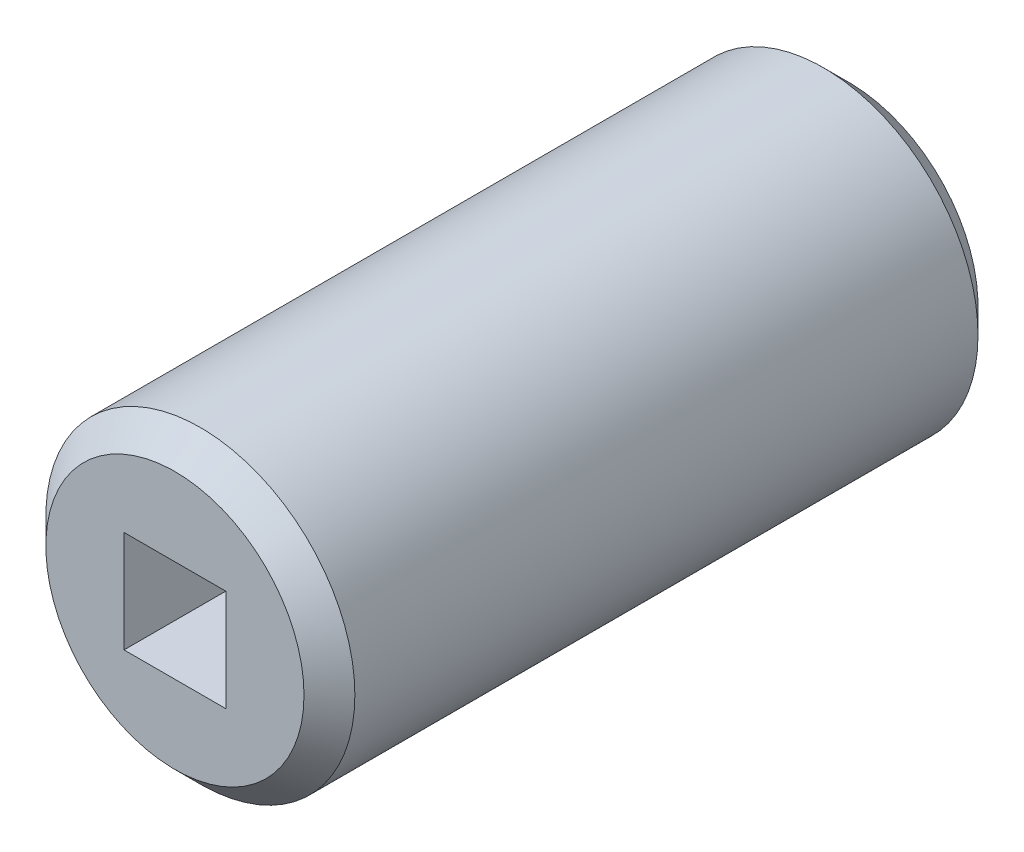
ISO-10303-21;
HEADER;
FILE_DESCRIPTION(('STEP AP214'),'2;1');
FILE_NAME('part.step','',(''),(''),'','','');
FILE_SCHEMA(('AUTOMOTIVE_DESIGN { 1 0 10303 214 1 1 1 1 }'));
ENDSEC;
DATA;
#1=APPLICATION_CONTEXT('core data for automotive mechanical design processes');
#2=APPLICATION_PROTOCOL_DEFINITION('international standard','automotive_design',2000,#1);
#3=PRODUCT_CONTEXT('',#1,'mechanical');
#4=PRODUCT('Part','Part','',(#3));
#5=PRODUCT_RELATED_PRODUCT_CATEGORY('part','',(#4));
#6=PRODUCT_DEFINITION_FORMATION('','',#4);
#7=PRODUCT_DEFINITION_CONTEXT('part definition',#1,'design');
#8=PRODUCT_DEFINITION('design','',#6,#7);
#9=PRODUCT_DEFINITION_SHAPE('','',#8);
#10=(LENGTH_UNIT() NAMED_UNIT(*) SI_UNIT(.MILLI.,.METRE.));
#11=(NAMED_UNIT(*) PLANE_ANGLE_UNIT() SI_UNIT($,.RADIAN.));
#12=(NAMED_UNIT(*) SI_UNIT($,.STERADIAN.) SOLID_ANGLE_UNIT());
#13=UNCERTAINTY_MEASURE_WITH_UNIT(LENGTH_MEASURE(1.E-05),#10,'distance_accuracy_value','');
#14=(GEOMETRIC_REPRESENTATION_CONTEXT(3) GLOBAL_UNCERTAINTY_ASSIGNED_CONTEXT((#13)) GLOBAL_UNIT_ASSIGNED_CONTEXT((#10,
#11,#12)) REPRESENTATION_CONTEXT('',''));
#15=CARTESIAN_POINT('',(0.,0.,0.));
#16=DIRECTION('',(0.,0.,1.));
#17=DIRECTION('',(1.,0.,0.));
#18=AXIS2_PLACEMENT_3D('',#15,#16,#17);
#19=CARTESIAN_POINT('',(0.,0.,-17.3));
#20=DIRECTION('',(0.,0.,1.));
#21=DIRECTION('',(1.,0.,0.));
#22=AXIS2_PLACEMENT_3D('',#19,#20,#21);
#23=CYLINDRICAL_SURFACE('',#22,6.075);
#24=CARTESIAN_POINT('',(0.,0.,8.20000000000002));
#25=DIRECTION('',(0.,0.,1.));
#26=DIRECTION('',(1.,0.,0.));
#27=AXIS2_PLACEMENT_3D('',#24,#25,#26);
#28=CIRCLE('',#27,6.075);
#29=CARTESIAN_POINT('',(6.075,0.,8.20000000000002));
#30=VERTEX_POINT('',#29);
#31=EDGE_CURVE('E12',#30,#30,#28,.F.);
#32=ORIENTED_EDGE('',*,*,#31,.T.);
#33=EDGE_LOOP('',(#32));
#34=FACE_BOUND('',#33,.T.);
#35=CARTESIAN_POINT('',(0.,0.,-16.3));
#36=DIRECTION('',(0.,0.,-1.));
#37=DIRECTION('',(-1.,0.,0.));
#38=AXIS2_PLACEMENT_3D('',#35,#36,#37);
#39=CIRCLE('',#38,6.075);
#40=CARTESIAN_POINT('',(-6.075,0.,-16.3));
#41=VERTEX_POINT('',#40);
#42=EDGE_CURVE('E117',#41,#41,#39,.F.);
#43=ORIENTED_EDGE('',*,*,#42,.T.);
#44=EDGE_LOOP('',(#43));
#45=FACE_BOUND('',#44,.T.);
#46=ADVANCED_FACE('F37',(#34,#45),#23,.T.);
#47=CARTESIAN_POINT('',(0.,0.,-17.3));
#48=DIRECTION('',(0.,0.,-1.));
#49=DIRECTION('',(-1.,0.,0.));
#50=AXIS2_PLACEMENT_3D('',#47,#48,#49);
#51=PLANE('',#50);
#52=DIRECTION('',(0.,1.,0.));
#53=VECTOR('',#52,1.);
#54=CARTESIAN_POINT('',(2.,-2.,-17.3));
#55=LINE('',#54,#53);
#56=CARTESIAN_POINT('',(2.,-2.,-17.3));
#57=VERTEX_POINT('',#56);
#58=CARTESIAN_POINT('',(2.,2.,-17.3));
#59=VERTEX_POINT('',#58);
#60=EDGE_CURVE('E80',#57,#59,#55,.T.);
#61=ORIENTED_EDGE('',*,*,#60,.T.);
#62=DIRECTION('',(-1.,0.,0.));
#63=VECTOR('',#62,1.);
#64=CARTESIAN_POINT('',(2.,2.,-17.3));
#65=LINE('',#64,#63);
#66=CARTESIAN_POINT('',(-2.,2.,-17.3));
#67=VERTEX_POINT('',#66);
#68=EDGE_CURVE('E89',#59,#67,#65,.T.);
#69=ORIENTED_EDGE('',*,*,#68,.T.);
#70=DIRECTION('',(0.,-1.,0.));
#71=VECTOR('',#70,1.);
#72=CARTESIAN_POINT('',(-2.,2.,-17.3));
#73=LINE('',#72,#71);
#74=CARTESIAN_POINT('',(-2.,-2.,-17.3));
#75=VERTEX_POINT('',#74);
#76=EDGE_CURVE('E52',#67,#75,#73,.T.);
#77=ORIENTED_EDGE('',*,*,#76,.T.);
#78=DIRECTION('',(1.,0.,0.));
#79=VECTOR('',#78,1.);
#80=CARTESIAN_POINT('',(-2.,-2.,-17.3));
#81=LINE('',#80,#79);
#82=EDGE_CURVE('E86',#75,#57,#81,.T.);
#83=ORIENTED_EDGE('',*,*,#82,.T.);
#84=EDGE_LOOP('',(#61,#69,#77,#83));
#85=FACE_BOUND('',#84,.T.);
#86=CARTESIAN_POINT('',(0.,0.,-17.3));
#87=DIRECTION('',(0.,0.,-1.));
#88=DIRECTION('',(-1.,0.,0.));
#89=AXIS2_PLACEMENT_3D('',#86,#87,#88);
#90=CIRCLE('',#89,5.075);
#91=CARTESIAN_POINT('',(-5.075,0.,-17.3));
#92=VERTEX_POINT('',#91);
#93=EDGE_CURVE('E111',#92,#92,#90,.T.);
#94=ORIENTED_EDGE('',*,*,#93,.T.);
#95=EDGE_LOOP('',(#94));
#96=FACE_BOUND('',#95,.T.);
#97=ADVANCED_FACE('F93',(#85,#96),#51,.T.);
#98=CARTESIAN_POINT('',(0.,0.,-17.3));
#99=DIRECTION('',(0.,0.,1.));
#100=DIRECTION('',(1.,0.,0.));
#101=AXIS2_PLACEMENT_3D('',#98,#99,#100);
#102=CONICAL_SURFACE('',#101,5.075,0.785398163397444);
#103=ORIENTED_EDGE('',*,*,#42,.F.);
#104=EDGE_LOOP('',(#103));
#105=FACE_BOUND('',#104,.T.);
#106=ORIENTED_EDGE('',*,*,#93,.F.);
#107=EDGE_LOOP('',(#106));
#108=FACE_BOUND('',#107,.T.);
#109=ADVANCED_FACE('F132',(#105,#108),#102,.T.);
#110=CARTESIAN_POINT('',(0.,0.,9.20000000000002));
#111=DIRECTION('',(0.,0.,1.));
#112=DIRECTION('',(1.,0.,0.));
#113=AXIS2_PLACEMENT_3D('',#110,#111,#112);
#114=PLANE('',#113);
#115=DIRECTION('',(0.,1.,0.));
#116=VECTOR('',#115,1.);
#117=CARTESIAN_POINT('',(2.,-2.,9.20000000000002));
#118=LINE('',#117,#116);
#119=CARTESIAN_POINT('',(2.,-2.,9.20000000000002));
#120=VERTEX_POINT('',#119);
#121=CARTESIAN_POINT('',(2.,2.,9.20000000000002));
#122=VERTEX_POINT('',#121);
#123=EDGE_CURVE('E60',#120,#122,#118,.T.);
#124=ORIENTED_EDGE('',*,*,#123,.F.);
#125=DIRECTION('',(1.,0.,0.));
#126=VECTOR('',#125,1.);
#127=CARTESIAN_POINT('',(-2.,-2.,9.20000000000002));
#128=LINE('',#127,#126);
#129=CARTESIAN_POINT('',(-2.,-2.,9.20000000000002));
#130=VERTEX_POINT('',#129);
#131=EDGE_CURVE('E96',#130,#120,#128,.T.);
#132=ORIENTED_EDGE('',*,*,#131,.F.);
#133=DIRECTION('',(0.,-1.,0.));
#134=VECTOR('',#133,1.);
#135=CARTESIAN_POINT('',(-2.,2.,9.20000000000002));
#136=LINE('',#135,#134);
#137=CARTESIAN_POINT('',(-2.,2.,9.20000000000002));
#138=VERTEX_POINT('',#137);
#139=EDGE_CURVE('E99',#138,#130,#136,.T.);
#140=ORIENTED_EDGE('',*,*,#139,.F.);
#141=DIRECTION('',(-1.,0.,0.));
#142=VECTOR('',#141,1.);
#143=CARTESIAN_POINT('',(2.,2.,9.20000000000002));
#144=LINE('',#143,#142);
#145=EDGE_CURVE('E105',#122,#138,#144,.T.);
#146=ORIENTED_EDGE('',*,*,#145,.F.);
#147=EDGE_LOOP('',(#124,#132,#140,#146));
#148=FACE_BOUND('',#147,.T.);
#149=CARTESIAN_POINT('',(0.,0.,9.20000000000002));
#150=DIRECTION('',(0.,0.,1.));
#151=DIRECTION('',(1.,0.,0.));
#152=AXIS2_PLACEMENT_3D('',#149,#150,#151);
#153=CIRCLE('',#152,5.075);
#154=CARTESIAN_POINT('',(5.075,0.,9.20000000000002));
#155=VERTEX_POINT('',#154);
#156=EDGE_CURVE('E45',#155,#155,#153,.T.);
#157=ORIENTED_EDGE('',*,*,#156,.T.);
#158=EDGE_LOOP('',(#157));
#159=FACE_BOUND('',#158,.T.);
#160=ADVANCED_FACE('F122',(#148,#159),#114,.T.);
#161=CARTESIAN_POINT('',(0.,0.,9.20000000000002));
#162=DIRECTION('',(0.,0.,-1.));
#163=DIRECTION('',(-1.,0.,0.));
#164=AXIS2_PLACEMENT_3D('',#161,#162,#163);
#165=CONICAL_SURFACE('',#164,5.075,0.785398163397446);
#166=ORIENTED_EDGE('',*,*,#31,.F.);
#167=EDGE_LOOP('',(#166));
#168=FACE_BOUND('',#167,.T.);
#169=ORIENTED_EDGE('',*,*,#156,.F.);
#170=EDGE_LOOP('',(#169));
#171=FACE_BOUND('',#170,.T.);
#172=ADVANCED_FACE('F39',(#168,#171),#165,.T.);
#173=CARTESIAN_POINT('',(2.,-2.,-17.3));
#174=DIRECTION('',(1.,0.,0.));
#175=DIRECTION('',(0.,1.,0.));
#176=AXIS2_PLACEMENT_3D('',#173,#174,#175);
#177=PLANE('',#176);
#178=ORIENTED_EDGE('',*,*,#123,.T.);
#179=DIRECTION('',(0.,0.,1.));
#180=VECTOR('',#179,1.);
#181=CARTESIAN_POINT('',(2.,2.,-17.3));
#182=LINE('',#181,#180);
#183=EDGE_CURVE('E76',#59,#122,#182,.T.);
#184=ORIENTED_EDGE('',*,*,#183,.F.);
#185=ORIENTED_EDGE('',*,*,#60,.F.);
#186=DIRECTION('',(0.,0.,1.));
#187=VECTOR('',#186,1.);
#188=CARTESIAN_POINT('',(2.,-2.,-17.3));
#189=LINE('',#188,#187);
#190=EDGE_CURVE('E109',#57,#120,#189,.T.);
#191=ORIENTED_EDGE('',*,*,#190,.T.);
#192=EDGE_LOOP('',(#178,#184,#185,#191));
#193=FACE_BOUND('',#192,.T.);
#194=ADVANCED_FACE('F78',(#193),#177,.F.);
#195=CARTESIAN_POINT('',(-2.,-2.,-17.3));
#196=DIRECTION('',(0.,-1.,0.));
#197=DIRECTION('',(1.,0.,0.));
#198=AXIS2_PLACEMENT_3D('',#195,#196,#197);
#199=PLANE('',#198);
#200=ORIENTED_EDGE('',*,*,#131,.T.);
#201=ORIENTED_EDGE('',*,*,#190,.F.);
#202=ORIENTED_EDGE('',*,*,#82,.F.);
#203=DIRECTION('',(0.,0.,1.));
#204=VECTOR('',#203,1.);
#205=CARTESIAN_POINT('',(-2.,-2.,-17.3));
#206=LINE('',#205,#204);
#207=EDGE_CURVE('E112',#75,#130,#206,.T.);
#208=ORIENTED_EDGE('',*,*,#207,.T.);
#209=EDGE_LOOP('',(#200,#201,#202,#208));
#210=FACE_BOUND('',#209,.T.);
#211=ADVANCED_FACE('F130',(#210),#199,.F.);
#212=CARTESIAN_POINT('',(-2.,2.,-17.3));
#213=DIRECTION('',(-1.,0.,0.));
#214=DIRECTION('',(0.,-1.,0.));
#215=AXIS2_PLACEMENT_3D('',#212,#213,#214);
#216=PLANE('',#215);
#217=ORIENTED_EDGE('',*,*,#139,.T.);
#218=ORIENTED_EDGE('',*,*,#207,.F.);
#219=ORIENTED_EDGE('',*,*,#76,.F.);
#220=DIRECTION('',(0.,0.,1.));
#221=VECTOR('',#220,1.);
#222=CARTESIAN_POINT('',(-2.,2.,-17.3));
#223=LINE('',#222,#221);
#224=EDGE_CURVE('E85',#67,#138,#223,.T.);
#225=ORIENTED_EDGE('',*,*,#224,.T.);
#226=EDGE_LOOP('',(#217,#218,#219,#225));
#227=FACE_BOUND('',#226,.T.);
#228=ADVANCED_FACE('F175',(#227),#216,.F.);
#229=CARTESIAN_POINT('',(2.,2.,-17.3));
#230=DIRECTION('',(0.,1.,0.));
#231=DIRECTION('',(-1.,0.,0.));
#232=AXIS2_PLACEMENT_3D('',#229,#230,#231);
#233=PLANE('',#232);
#234=ORIENTED_EDGE('',*,*,#145,.T.);
#235=ORIENTED_EDGE('',*,*,#224,.F.);
#236=ORIENTED_EDGE('',*,*,#68,.F.);
#237=ORIENTED_EDGE('',*,*,#183,.T.);
#238=EDGE_LOOP('',(#234,#235,#236,#237));
#239=FACE_BOUND('',#238,.T.);
#240=ADVANCED_FACE('F90',(#239),#233,.F.);
#241=CLOSED_SHELL('',(#46,#97,#109,#160,#172,#194,#211,#228,#240));
#242=MANIFOLD_SOLID_BREP('B2',#241);
#243=ADVANCED_BREP_SHAPE_REPRESENTATION('',(#18,#242),#14);
#244=SHAPE_DEFINITION_REPRESENTATION(#9,#243);
ENDSEC;
END-ISO-10303-21;
